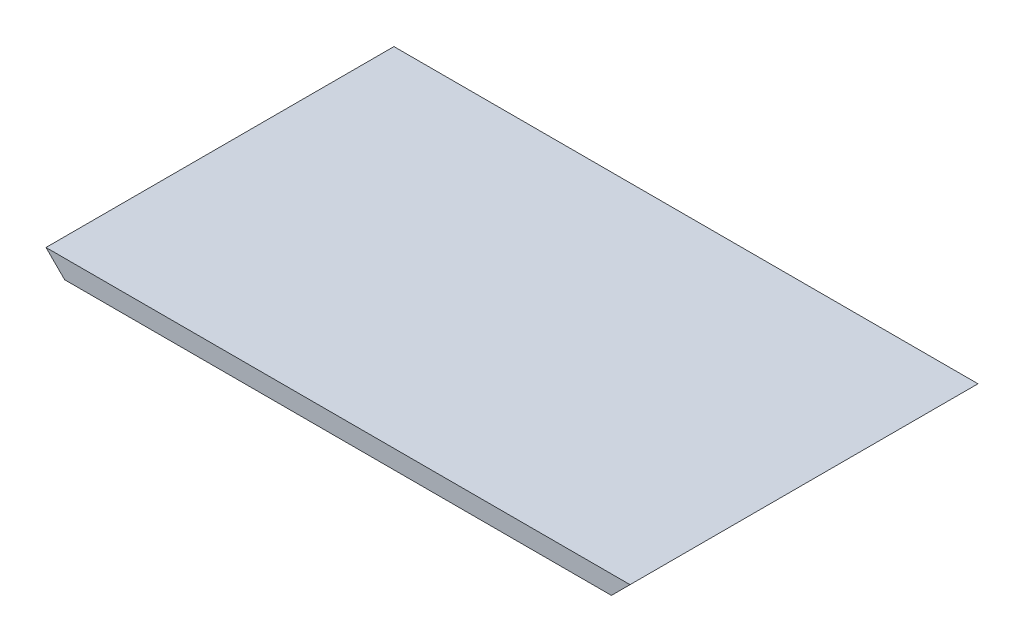
ISO-10303-21;
HEADER;
FILE_DESCRIPTION(('STEP AP214'),'2;1');
FILE_NAME('part.step','',(''),(''),'','','');
FILE_SCHEMA(('AUTOMOTIVE_DESIGN { 1 0 10303 214 1 1 1 1 }'));
ENDSEC;
DATA;
#1=APPLICATION_CONTEXT('core data for automotive mechanical design processes');
#2=APPLICATION_PROTOCOL_DEFINITION('international standard','automotive_design',2000,#1);
#3=PRODUCT_CONTEXT('',#1,'mechanical');
#4=PRODUCT('Part','Part','',(#3));
#5=PRODUCT_RELATED_PRODUCT_CATEGORY('part','',(#4));
#6=PRODUCT_DEFINITION_FORMATION('','',#4);
#7=PRODUCT_DEFINITION_CONTEXT('part definition',#1,'design');
#8=PRODUCT_DEFINITION('design','',#6,#7);
#9=PRODUCT_DEFINITION_SHAPE('','',#8);
#10=(LENGTH_UNIT() NAMED_UNIT(*) SI_UNIT(.MILLI.,.METRE.));
#11=(NAMED_UNIT(*) PLANE_ANGLE_UNIT() SI_UNIT($,.RADIAN.));
#12=(NAMED_UNIT(*) SI_UNIT($,.STERADIAN.) SOLID_ANGLE_UNIT());
#13=UNCERTAINTY_MEASURE_WITH_UNIT(LENGTH_MEASURE(1.E-05),#10,'distance_accuracy_value','');
#14=(GEOMETRIC_REPRESENTATION_CONTEXT(3) GLOBAL_UNCERTAINTY_ASSIGNED_CONTEXT((#13)) GLOBAL_UNIT_ASSIGNED_CONTEXT((#10,
#11,#12)) REPRESENTATION_CONTEXT('',''));
#15=CARTESIAN_POINT('',(0.,0.,0.));
#16=DIRECTION('',(0.,0.,1.));
#17=DIRECTION('',(1.,0.,0.));
#18=AXIS2_PLACEMENT_3D('',#15,#16,#17);
#19=CARTESIAN_POINT('',(298.45,9.525,177.8));
#20=DIRECTION('',(0.,0.,-1.));
#21=DIRECTION('',(-1.,0.,0.));
#22=AXIS2_PLACEMENT_3D('',#19,#20,#21);
#23=PLANE('',#22);
#24=DIRECTION('',(1.,0.,0.));
#25=VECTOR('',#24,1.);
#26=CARTESIAN_POINT('',(298.45,-9.525,177.8));
#27=LINE('',#26,#25);
#28=CARTESIAN_POINT('',(-279.4,-9.525,177.8));
#29=VERTEX_POINT('',#28);
#30=CARTESIAN_POINT('',(279.4,-9.525,177.8));
#31=VERTEX_POINT('',#30);
#32=EDGE_CURVE('E91',#29,#31,#27,.T.);
#33=ORIENTED_EDGE('',*,*,#32,.T.);
#34=DIRECTION('',(0.707106781186549,0.707106781186547,0.));
#35=VECTOR('',#34,1.);
#36=CARTESIAN_POINT('',(298.45,9.52500000000009,177.8));
#37=LINE('',#36,#35);
#38=CARTESIAN_POINT('',(298.45,9.525,177.8));
#39=VERTEX_POINT('',#38);
#40=EDGE_CURVE('E11',#31,#39,#37,.T.);
#41=ORIENTED_EDGE('',*,*,#40,.T.);
#42=DIRECTION('',(1.,0.,0.));
#43=VECTOR('',#42,1.);
#44=CARTESIAN_POINT('',(298.45,9.525,177.8));
#45=LINE('',#44,#43);
#46=CARTESIAN_POINT('',(-298.45,9.525,177.8));
#47=VERTEX_POINT('',#46);
#48=EDGE_CURVE('E77',#47,#39,#45,.T.);
#49=ORIENTED_EDGE('',*,*,#48,.F.);
#50=DIRECTION('',(0.707106781186549,-0.707106781186547,0.));
#51=VECTOR('',#50,1.);
#52=CARTESIAN_POINT('',(-298.45,9.52499999999999,177.8));
#53=LINE('',#52,#51);
#54=EDGE_CURVE('E40',#47,#29,#53,.T.);
#55=ORIENTED_EDGE('',*,*,#54,.T.);
#56=EDGE_LOOP('',(#33,#41,#49,#55));
#57=FACE_BOUND('',#56,.T.);
#58=ADVANCED_FACE('F32',(#57),#23,.F.);
#59=CARTESIAN_POINT('',(298.45,9.525,-177.8));
#60=DIRECTION('',(0.,0.,1.));
#61=DIRECTION('',(1.,0.,0.));
#62=AXIS2_PLACEMENT_3D('',#59,#60,#61);
#63=PLANE('',#62);
#64=DIRECTION('',(-1.,0.,0.));
#65=VECTOR('',#64,1.);
#66=CARTESIAN_POINT('',(298.45,9.525,-177.8));
#67=LINE('',#66,#65);
#68=CARTESIAN_POINT('',(298.45,9.525,-177.8));
#69=VERTEX_POINT('',#68);
#70=CARTESIAN_POINT('',(-298.45,9.525,-177.8));
#71=VERTEX_POINT('',#70);
#72=EDGE_CURVE('E87',#69,#71,#67,.T.);
#73=ORIENTED_EDGE('',*,*,#72,.F.);
#74=DIRECTION('',(-0.707106781186549,-0.707106781186547,0.));
#75=VECTOR('',#74,1.);
#76=CARTESIAN_POINT('',(298.45,9.52500000000001,-177.8));
#77=LINE('',#76,#75);
#78=CARTESIAN_POINT('',(279.4,-9.525,-177.8));
#79=VERTEX_POINT('',#78);
#80=EDGE_CURVE('E99',#69,#79,#77,.T.);
#81=ORIENTED_EDGE('',*,*,#80,.T.);
#82=DIRECTION('',(-1.,0.,0.));
#83=VECTOR('',#82,1.);
#84=CARTESIAN_POINT('',(298.45,-9.525,-177.8));
#85=LINE('',#84,#83);
#86=CARTESIAN_POINT('',(-279.4,-9.525,-177.8));
#87=VERTEX_POINT('',#86);
#88=EDGE_CURVE('E88',#79,#87,#85,.T.);
#89=ORIENTED_EDGE('',*,*,#88,.T.);
#90=DIRECTION('',(-0.707106781186549,0.707106781186547,0.));
#91=VECTOR('',#90,1.);
#92=CARTESIAN_POINT('',(-298.45,9.52500000000001,-177.8));
#93=LINE('',#92,#91);
#94=EDGE_CURVE('E96',#87,#71,#93,.T.);
#95=ORIENTED_EDGE('',*,*,#94,.T.);
#96=EDGE_LOOP('',(#73,#81,#89,#95));
#97=FACE_BOUND('',#96,.T.);
#98=ADVANCED_FACE('F104',(#97),#63,.F.);
#99=CARTESIAN_POINT('',(0.,9.525,0.));
#100=DIRECTION('',(0.,-1.,0.));
#101=DIRECTION('',(0.,0.,-1.));
#102=AXIS2_PLACEMENT_3D('',#99,#100,#101);
#103=PLANE('',#102);
#104=DIRECTION('',(0.,0.,1.));
#105=VECTOR('',#104,1.);
#106=CARTESIAN_POINT('',(-298.45,9.525,-177.8));
#107=LINE('',#106,#105);
#108=EDGE_CURVE('E74',#71,#47,#107,.T.);
#109=ORIENTED_EDGE('',*,*,#108,.T.);
#110=ORIENTED_EDGE('',*,*,#48,.T.);
#111=DIRECTION('',(0.,0.,-1.));
#112=VECTOR('',#111,1.);
#113=CARTESIAN_POINT('',(298.45,9.525,-177.8));
#114=LINE('',#113,#112);
#115=EDGE_CURVE('E82',#39,#69,#114,.T.);
#116=ORIENTED_EDGE('',*,*,#115,.T.);
#117=ORIENTED_EDGE('',*,*,#72,.T.);
#118=EDGE_LOOP('',(#109,#110,#116,#117));
#119=FACE_BOUND('',#118,.T.);
#120=ADVANCED_FACE('F85',(#119),#103,.F.);
#121=CARTESIAN_POINT('',(0.,-9.525,0.));
#122=DIRECTION('',(0.,-1.,0.));
#123=DIRECTION('',(0.,0.,-1.));
#124=AXIS2_PLACEMENT_3D('',#121,#122,#123);
#125=PLANE('',#124);
#126=ORIENTED_EDGE('',*,*,#88,.F.);
#127=DIRECTION('',(0.,0.,1.));
#128=VECTOR('',#127,1.);
#129=CARTESIAN_POINT('',(279.4,-9.525,177.8));
#130=LINE('',#129,#128);
#131=EDGE_CURVE('E47',#79,#31,#130,.T.);
#132=ORIENTED_EDGE('',*,*,#131,.T.);
#133=ORIENTED_EDGE('',*,*,#32,.F.);
#134=DIRECTION('',(0.,0.,-1.));
#135=VECTOR('',#134,1.);
#136=CARTESIAN_POINT('',(-279.4,-9.525,-177.8));
#137=LINE('',#136,#135);
#138=EDGE_CURVE('E75',#29,#87,#137,.T.);
#139=ORIENTED_EDGE('',*,*,#138,.T.);
#140=EDGE_LOOP('',(#126,#132,#133,#139));
#141=FACE_BOUND('',#140,.T.);
#142=ADVANCED_FACE('F102',(#141),#125,.T.);
#143=CARTESIAN_POINT('',(298.45,9.52500000000001,-177.8));
#144=DIRECTION('',(0.707106781186547,-0.707106781186549,0.));
#145=DIRECTION('',(0.,0.,1.));
#146=AXIS2_PLACEMENT_3D('',#143,#144,#145);
#147=PLANE('',#146);
#148=ORIENTED_EDGE('',*,*,#40,.F.);
#149=ORIENTED_EDGE('',*,*,#131,.F.);
#150=ORIENTED_EDGE('',*,*,#80,.F.);
#151=ORIENTED_EDGE('',*,*,#115,.F.);
#152=EDGE_LOOP('',(#148,#149,#150,#151));
#153=FACE_BOUND('',#152,.T.);
#154=ADVANCED_FACE('F106',(#153),#147,.T.);
#155=CARTESIAN_POINT('',(-298.45,9.52500000000001,-177.8));
#156=DIRECTION('',(-0.707106781186547,-0.707106781186549,0.));
#157=DIRECTION('',(0.,0.,-1.));
#158=AXIS2_PLACEMENT_3D('',#155,#156,#157);
#159=PLANE('',#158);
#160=ORIENTED_EDGE('',*,*,#94,.F.);
#161=ORIENTED_EDGE('',*,*,#138,.F.);
#162=ORIENTED_EDGE('',*,*,#54,.F.);
#163=ORIENTED_EDGE('',*,*,#108,.F.);
#164=EDGE_LOOP('',(#160,#161,#162,#163));
#165=FACE_BOUND('',#164,.T.);
#166=ADVANCED_FACE('F34',(#165),#159,.T.);
#167=CLOSED_SHELL('',(#58,#98,#120,#142,#154,#166));
#168=MANIFOLD_SOLID_BREP('B2',#167);
#169=ADVANCED_BREP_SHAPE_REPRESENTATION('',(#18,#168),#14);
#170=SHAPE_DEFINITION_REPRESENTATION(#9,#169);
ENDSEC;
END-ISO-10303-21;
